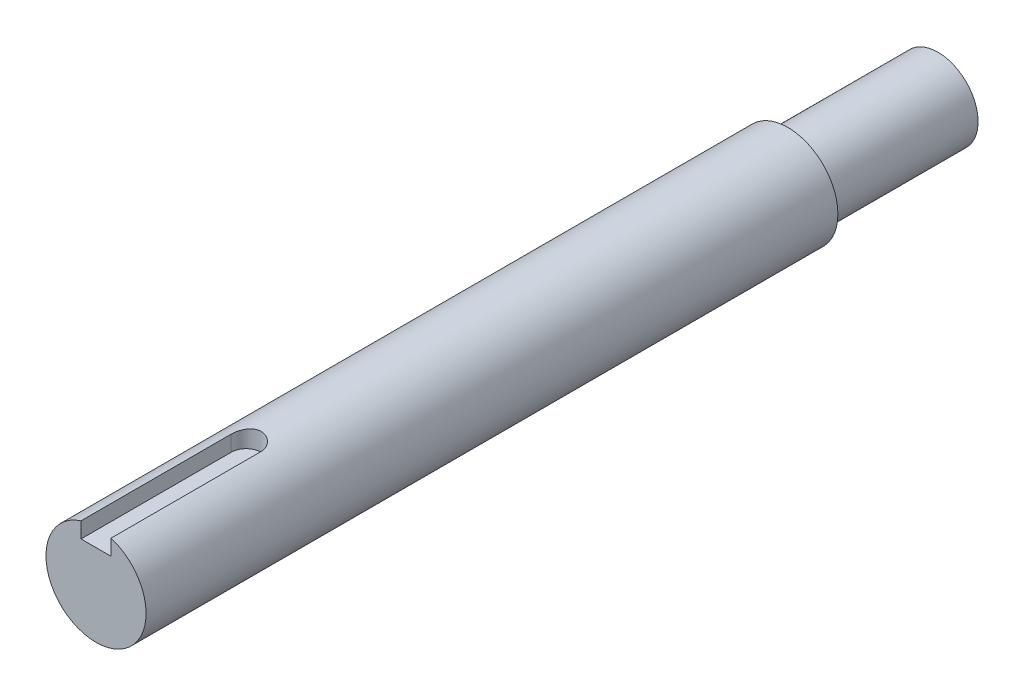
ISO-10303-21;
HEADER;
FILE_DESCRIPTION(('STEP AP214'),'2;1');
FILE_NAME('part.step','',(''),(''),'','','');
FILE_SCHEMA(('AUTOMOTIVE_DESIGN { 1 0 10303 214 1 1 1 1 }'));
ENDSEC;
DATA;
#1=APPLICATION_CONTEXT('core data for automotive mechanical design processes');
#2=APPLICATION_PROTOCOL_DEFINITION('international standard','automotive_design',2000,#1);
#3=PRODUCT_CONTEXT('',#1,'mechanical');
#4=PRODUCT('Part','Part','',(#3));
#5=PRODUCT_RELATED_PRODUCT_CATEGORY('part','',(#4));
#6=PRODUCT_DEFINITION_FORMATION('','',#4);
#7=PRODUCT_DEFINITION_CONTEXT('part definition',#1,'design');
#8=PRODUCT_DEFINITION('design','',#6,#7);
#9=PRODUCT_DEFINITION_SHAPE('','',#8);
#10=(LENGTH_UNIT() NAMED_UNIT(*) SI_UNIT(.MILLI.,.METRE.));
#11=(NAMED_UNIT(*) PLANE_ANGLE_UNIT() SI_UNIT($,.RADIAN.));
#12=(NAMED_UNIT(*) SI_UNIT($,.STERADIAN.) SOLID_ANGLE_UNIT());
#13=UNCERTAINTY_MEASURE_WITH_UNIT(LENGTH_MEASURE(1.E-05),#10,'distance_accuracy_value','');
#14=(GEOMETRIC_REPRESENTATION_CONTEXT(3) GLOBAL_UNCERTAINTY_ASSIGNED_CONTEXT((#13)) GLOBAL_UNIT_ASSIGNED_CONTEXT((#10,
#11,#12)) REPRESENTATION_CONTEXT('',''));
#15=CARTESIAN_POINT('',(0.,0.,0.));
#16=DIRECTION('',(0.,0.,1.));
#17=DIRECTION('',(1.,0.,0.));
#18=AXIS2_PLACEMENT_3D('',#15,#16,#17);
#19=CARTESIAN_POINT('',(0.,0.,69.1));
#20=DIRECTION('',(0.,0.,-1.));
#21=DIRECTION('',(-1.,0.,0.));
#22=AXIS2_PLACEMENT_3D('',#19,#20,#21);
#23=CYLINDRICAL_SURFACE('',#22,5.);
#24=CARTESIAN_POINT('',(0.,0.,0.));
#25=DIRECTION('',(0.,0.,1.));
#26=DIRECTION('',(1.,0.,0.));
#27=AXIS2_PLACEMENT_3D('',#24,#25,#26);
#28=CIRCLE('',#27,5.);
#29=CARTESIAN_POINT('',(5.,0.,0.));
#30=VERTEX_POINT('',#29);
#31=EDGE_CURVE('E111',#30,#30,#28,.T.);
#32=ORIENTED_EDGE('',*,*,#31,.T.);
#33=EDGE_LOOP('',(#32));
#34=FACE_BOUND('',#33,.T.);
#35=DIRECTION('',(0.,0.,-1.));
#36=VECTOR('',#35,1.);
#37=CARTESIAN_POINT('',(-1.49999999999999,4.76969600708473,69.1));
#38=LINE('',#37,#36);
#39=CARTESIAN_POINT('',(-1.49999999999999,4.76969600708473,69.1));
#40=VERTEX_POINT('',#39);
#41=CARTESIAN_POINT('',(-1.49999999999999,4.76969600708473,54.1));
#42=VERTEX_POINT('',#41);
#43=EDGE_CURVE('E102',#40,#42,#38,.T.);
#44=ORIENTED_EDGE('',*,*,#43,.T.);
#45=CARTESIAN_POINT('',(-1.5,4.76969600708473,54.1));
#46=CARTESIAN_POINT('',(-1.5000008535707,4.76969249084934,54.058820607092));
#47=CARTESIAN_POINT('',(-1.49830317083427,4.77022997000129,54.0176619568739));
#48=CARTESIAN_POINT('',(-1.49153785660316,4.77235095109999,53.9356588379044));
#49=CARTESIAN_POINT('',(-1.4864709827584,4.77393421787376,53.8948143006051));
#50=CARTESIAN_POINT('',(-1.4663020368931,4.78018490618873,53.7734094590453));
#51=CARTESIAN_POINT('',(-1.44623120413662,4.78635370384275,53.6936936095836));
#52=CARTESIAN_POINT('',(-1.39353102315626,4.80195952113208,53.5389644216141));
#53=CARTESIAN_POINT('',(-1.36090607068203,4.81139539670393,53.4639494478019));
#54=CARTESIAN_POINT('',(-1.28407841117655,4.83246571212052,53.3204033184024));
#55=CARTESIAN_POINT('',(-1.23987031651226,4.84410117434933,53.2518752002716));
#56=CARTESIAN_POINT('',(-1.13964850658326,4.86866835244721,53.1211339440029));
#57=CARTESIAN_POINT('',(-1.08333433465208,4.88162755412974,53.0591563396566));
#58=CARTESIAN_POINT('',(-0.961138919873346,4.90714811559049,52.9453644161));
#59=CARTESIAN_POINT('',(-0.895256063916339,4.91970940785249,52.8935518139969));
#60=CARTESIAN_POINT('',(-0.754109921315419,4.94333239727705,52.8005362296815));
#61=CARTESIAN_POINT('',(-0.678680819336249,4.95435770971354,52.759574819702));
#62=CARTESIAN_POINT('',(-0.521621185505765,4.97334469846208,52.6910115883818));
#63=CARTESIAN_POINT('',(-0.43999225901292,4.98130716463903,52.6634063222057));
#64=CARTESIAN_POINT('',(-0.275324697874871,4.99307639935002,52.6231202008979));
#65=CARTESIAN_POINT('',(-0.192393125294246,4.99699549276993,52.6100351420302));
#66=CARTESIAN_POINT('',(-0.0254235719980733,5.00063202022426,52.5978826586367));
#67=CARTESIAN_POINT('',(0.0586141962423714,5.00035024971471,52.5988125802998));
#68=CARTESIAN_POINT('',(0.222571599946026,4.99569602566267,52.614392908759));
#69=CARTESIAN_POINT('',(0.302537145464649,4.99145415509187,52.6286053449787));
#70=CARTESIAN_POINT('',(0.458890052102033,4.9795151369998,52.6696316352381));
#71=CARTESIAN_POINT('',(0.535277225532005,4.97181780846028,52.6964461494559));
#72=CARTESIAN_POINT('',(0.683347815892225,4.95365214926145,52.7622122216464));
#73=CARTESIAN_POINT('',(0.754966006044153,4.94315255692525,52.8013016443569));
#74=CARTESIAN_POINT('',(0.890765529574432,4.92049624651755,52.8903985900483));
#75=CARTESIAN_POINT('',(0.954945191614605,4.90833915735884,52.9404085594788));
#76=CARTESIAN_POINT('',(1.07665450541276,4.88311673571409,53.0521919880835));
#77=CARTESIAN_POINT('',(1.13383351478035,4.87003445449553,53.1143438637607));
#78=CARTESIAN_POINT('',(1.23706769492488,4.84484215114658,53.2474974234279));
#79=CARTESIAN_POINT('',(1.28311962013079,4.83273241337565,53.3185016803655));
#80=CARTESIAN_POINT('',(1.36316407240864,4.81077228795653,53.4682809284493));
#81=CARTESIAN_POINT('',(1.39703006341136,4.80094596245948,53.5471271795934));
#82=CARTESIAN_POINT('',(1.450858860047,4.78495663653201,53.7097245039817));
#83=CARTESIAN_POINT('',(1.47084293218036,4.77878803475874,53.7934678607144));
#84=CARTESIAN_POINT('',(1.48901203590081,4.77314032325005,53.9149948890702));
#85=CARTESIAN_POINT('',(1.4931320298901,4.77185156275266,53.9518907341796));
#86=CARTESIAN_POINT('',(1.49862355614855,4.77012928611782,54.0258514790995));
#87=CARTESIAN_POINT('',(1.4999991296827,4.76969451246643,54.0629160496639));
#88=CARTESIAN_POINT('',(1.50000000000001,4.76969600708472,54.1));
#89=B_SPLINE_CURVE_WITH_KNOTS('',3,(#45,#46,#47,#48,#49,#50,#51,#52,#53,#54,#55,#56,#57,#58,#59,
#60,#61,#62,#63,#64,#65,#66,#67,#68,#69,#70,#71,#72,#73,#74,#75,#76,#77,#78,#79,#80,#81,#82,#83,
#84,#85,#86,#87,#88),.UNSPECIFIED.,.F.,.F.,(4,2,2,2,2,2,2,2,2,2,2,2,2,2,2,2,2,2,2,2,2,4),(0.,
0.123459071219744,0.246890388853047,0.492911349615212,0.738846245884322,0.984895736828089,
1.23795510798803,1.49105719006937,1.74939356197456,2.00766326783256,2.25854751319802,
2.50938425289471,2.75223130012967,2.99509107067836,3.24078242562731,3.48652887757005,
3.74172568310982,3.99699683536778,4.25484698071527,4.51230123440207,4.62365084745809,
4.73483637253616),.UNSPECIFIED.);
#90=CARTESIAN_POINT('',(1.50000000000001,4.76969600708473,54.1));
#91=VERTEX_POINT('',#90);
#92=EDGE_CURVE('E11',#42,#91,#89,.T.);
#93=ORIENTED_EDGE('',*,*,#92,.T.);
#94=DIRECTION('',(0.,0.,-1.));
#95=VECTOR('',#94,1.);
#96=CARTESIAN_POINT('',(1.50000000000001,4.76969600708473,69.1));
#97=LINE('',#96,#95);
#98=CARTESIAN_POINT('',(1.50000000000001,4.76969600708473,69.1));
#99=VERTEX_POINT('',#98);
#100=EDGE_CURVE('E61',#99,#91,#97,.T.);
#101=ORIENTED_EDGE('',*,*,#100,.F.);
#102=CARTESIAN_POINT('',(0.,0.,69.1));
#103=DIRECTION('',(0.,0.,1.));
#104=DIRECTION('',(1.,0.,0.));
#105=AXIS2_PLACEMENT_3D('',#102,#103,#104);
#106=CIRCLE('',#105,5.);
#107=EDGE_CURVE('E114',#40,#99,#106,.T.);
#108=ORIENTED_EDGE('',*,*,#107,.F.);
#109=EDGE_LOOP('',(#44,#93,#101,#108));
#110=FACE_BOUND('',#109,.T.);
#111=ADVANCED_FACE('F33',(#34,#110),#23,.T.);
#112=CARTESIAN_POINT('',(0.,0.,69.1));
#113=DIRECTION('',(0.,0.,1.));
#114=DIRECTION('',(1.,0.,0.));
#115=AXIS2_PLACEMENT_3D('',#112,#113,#114);
#116=PLANE('',#115);
#117=ORIENTED_EDGE('',*,*,#107,.T.);
#118=DIRECTION('',(0.,1.,0.));
#119=VECTOR('',#118,1.);
#120=CARTESIAN_POINT('',(1.50000000000001,3.2,69.1));
#121=LINE('',#120,#119);
#122=CARTESIAN_POINT('',(1.50000000000001,3.2,69.1));
#123=VERTEX_POINT('',#122);
#124=EDGE_CURVE('E103',#123,#99,#121,.T.);
#125=ORIENTED_EDGE('',*,*,#124,.F.);
#126=DIRECTION('',(1.,0.,0.));
#127=VECTOR('',#126,1.);
#128=CARTESIAN_POINT('',(0.,3.2,69.1));
#129=LINE('',#128,#127);
#130=CARTESIAN_POINT('',(-1.5,3.2,69.1));
#131=VERTEX_POINT('',#130);
#132=EDGE_CURVE('E92',#131,#123,#129,.T.);
#133=ORIENTED_EDGE('',*,*,#132,.F.);
#134=DIRECTION('',(0.,1.,0.));
#135=VECTOR('',#134,1.);
#136=CARTESIAN_POINT('',(-1.49999999999999,3.2,69.1));
#137=LINE('',#136,#135);
#138=EDGE_CURVE('E86',#131,#40,#137,.T.);
#139=ORIENTED_EDGE('',*,*,#138,.T.);
#140=EDGE_LOOP('',(#117,#125,#133,#139));
#141=FACE_BOUND('',#140,.T.);
#142=ADVANCED_FACE('F124',(#141),#116,.T.);
#143=CARTESIAN_POINT('',(0.,0.,0.));
#144=DIRECTION('',(0.,0.,1.));
#145=DIRECTION('',(1.,0.,0.));
#146=AXIS2_PLACEMENT_3D('',#143,#144,#145);
#147=PLANE('',#146);
#148=CARTESIAN_POINT('',(0.,0.,0.));
#149=DIRECTION('',(0.,0.,-1.));
#150=DIRECTION('',(-1.,0.,0.));
#151=AXIS2_PLACEMENT_3D('',#148,#149,#150);
#152=CIRCLE('',#151,4.);
#153=CARTESIAN_POINT('',(-4.,0.,0.));
#154=VERTEX_POINT('',#153);
#155=EDGE_CURVE('E46',#154,#154,#152,.T.);
#156=ORIENTED_EDGE('',*,*,#155,.F.);
#157=EDGE_LOOP('',(#156));
#158=FACE_BOUND('',#157,.T.);
#159=ORIENTED_EDGE('',*,*,#31,.F.);
#160=EDGE_LOOP('',(#159));
#161=FACE_BOUND('',#160,.T.);
#162=ADVANCED_FACE('F121',(#158,#161),#147,.F.);
#163=CARTESIAN_POINT('',(0.,0.,-15.));
#164=DIRECTION('',(0.,0.,1.));
#165=DIRECTION('',(1.,0.,0.));
#166=AXIS2_PLACEMENT_3D('',#163,#164,#165);
#167=CYLINDRICAL_SURFACE('',#166,4.);
#168=CARTESIAN_POINT('',(0.,0.,-15.));
#169=DIRECTION('',(0.,0.,-1.));
#170=DIRECTION('',(-1.,0.,0.));
#171=AXIS2_PLACEMENT_3D('',#168,#169,#170);
#172=CIRCLE('',#171,4.);
#173=CARTESIAN_POINT('',(-4.,0.,-15.));
#174=VERTEX_POINT('',#173);
#175=EDGE_CURVE('E108',#174,#174,#172,.T.);
#176=ORIENTED_EDGE('',*,*,#175,.F.);
#177=EDGE_LOOP('',(#176));
#178=FACE_BOUND('',#177,.T.);
#179=ORIENTED_EDGE('',*,*,#155,.T.);
#180=EDGE_LOOP('',(#179));
#181=FACE_BOUND('',#180,.T.);
#182=ADVANCED_FACE('F123',(#178,#181),#167,.T.);
#183=CARTESIAN_POINT('',(0.,0.,-15.));
#184=DIRECTION('',(0.,0.,-1.));
#185=DIRECTION('',(-1.,0.,0.));
#186=AXIS2_PLACEMENT_3D('',#183,#184,#185);
#187=PLANE('',#186);
#188=ORIENTED_EDGE('',*,*,#175,.T.);
#189=EDGE_LOOP('',(#188));
#190=FACE_BOUND('',#189,.T.);
#191=ADVANCED_FACE('F130',(#190),#187,.T.);
#192=CARTESIAN_POINT('',(0.,3.2,54.1));
#193=DIRECTION('',(0.,1.,0.));
#194=DIRECTION('',(0.,0.,1.));
#195=AXIS2_PLACEMENT_3D('',#192,#193,#194);
#196=CYLINDRICAL_SURFACE('',#195,1.5);
#197=DIRECTION('',(0.,1.,0.));
#198=VECTOR('',#197,1.);
#199=CARTESIAN_POINT('',(-1.49999999999999,3.2,54.1));
#200=LINE('',#199,#198);
#201=CARTESIAN_POINT('',(-1.49999999999999,3.2,54.1));
#202=VERTEX_POINT('',#201);
#203=EDGE_CURVE('E81',#202,#42,#200,.T.);
#204=ORIENTED_EDGE('',*,*,#203,.F.);
#205=CARTESIAN_POINT('',(0.,3.2,54.1));
#206=DIRECTION('',(0.,1.,0.));
#207=DIRECTION('',(0.,0.,1.));
#208=AXIS2_PLACEMENT_3D('',#205,#206,#207);
#209=CIRCLE('',#208,1.5);
#210=CARTESIAN_POINT('',(1.50000000000001,3.2,54.1));
#211=VERTEX_POINT('',#210);
#212=EDGE_CURVE('E83',#211,#202,#209,.T.);
#213=ORIENTED_EDGE('',*,*,#212,.F.);
#214=DIRECTION('',(0.,1.,0.));
#215=VECTOR('',#214,1.);
#216=CARTESIAN_POINT('',(1.50000000000001,3.2,54.1));
#217=LINE('',#216,#215);
#218=EDGE_CURVE('E100',#211,#91,#217,.T.);
#219=ORIENTED_EDGE('',*,*,#218,.T.);
#220=ORIENTED_EDGE('',*,*,#92,.F.);
#221=EDGE_LOOP('',(#204,#213,#219,#220));
#222=FACE_BOUND('',#221,.T.);
#223=ADVANCED_FACE('F82',(#222),#196,.F.);
#224=CARTESIAN_POINT('',(1.5,3.2,0.));
#225=DIRECTION('',(-1.,0.,0.));
#226=DIRECTION('',(0.,0.,1.));
#227=AXIS2_PLACEMENT_3D('',#224,#225,#226);
#228=PLANE('',#227);
#229=ORIENTED_EDGE('',*,*,#100,.T.);
#230=ORIENTED_EDGE('',*,*,#218,.F.);
#231=DIRECTION('',(0.,0.,1.));
#232=VECTOR('',#231,1.);
#233=CARTESIAN_POINT('',(1.5,3.2,0.));
#234=LINE('',#233,#232);
#235=EDGE_CURVE('E87',#211,#123,#234,.T.);
#236=ORIENTED_EDGE('',*,*,#235,.T.);
#237=ORIENTED_EDGE('',*,*,#124,.T.);
#238=EDGE_LOOP('',(#229,#230,#236,#237));
#239=FACE_BOUND('',#238,.T.);
#240=ADVANCED_FACE('F154',(#239),#228,.T.);
#241=CARTESIAN_POINT('',(-1.5,3.2,0.));
#242=DIRECTION('',(-1.,0.,0.));
#243=DIRECTION('',(0.,0.,1.));
#244=AXIS2_PLACEMENT_3D('',#241,#242,#243);
#245=PLANE('',#244);
#246=ORIENTED_EDGE('',*,*,#138,.F.);
#247=DIRECTION('',(0.,0.,1.));
#248=VECTOR('',#247,1.);
#249=CARTESIAN_POINT('',(-1.5,3.2,0.));
#250=LINE('',#249,#248);
#251=EDGE_CURVE('E53',#202,#131,#250,.T.);
#252=ORIENTED_EDGE('',*,*,#251,.F.);
#253=ORIENTED_EDGE('',*,*,#203,.T.);
#254=ORIENTED_EDGE('',*,*,#43,.F.);
#255=EDGE_LOOP('',(#246,#252,#253,#254));
#256=FACE_BOUND('',#255,.T.);
#257=ADVANCED_FACE('F89',(#256),#245,.F.);
#258=CARTESIAN_POINT('',(0.,3.2,0.));
#259=DIRECTION('',(0.,1.,0.));
#260=DIRECTION('',(0.,0.,1.));
#261=AXIS2_PLACEMENT_3D('',#258,#259,#260);
#262=PLANE('',#261);
#263=ORIENTED_EDGE('',*,*,#212,.T.);
#264=ORIENTED_EDGE('',*,*,#251,.T.);
#265=ORIENTED_EDGE('',*,*,#132,.T.);
#266=ORIENTED_EDGE('',*,*,#235,.F.);
#267=EDGE_LOOP('',(#263,#264,#265,#266));
#268=FACE_BOUND('',#267,.T.);
#269=ADVANCED_FACE('F95',(#268),#262,.T.);
#270=CLOSED_SHELL('',(#111,#142,#162,#182,#191,#223,#240,#257,#269));
#271=MANIFOLD_SOLID_BREP('B2',#270);
#272=ADVANCED_BREP_SHAPE_REPRESENTATION('',(#18,#271),#14);
#273=SHAPE_DEFINITION_REPRESENTATION(#9,#272);
ENDSEC;
END-ISO-10303-21;
